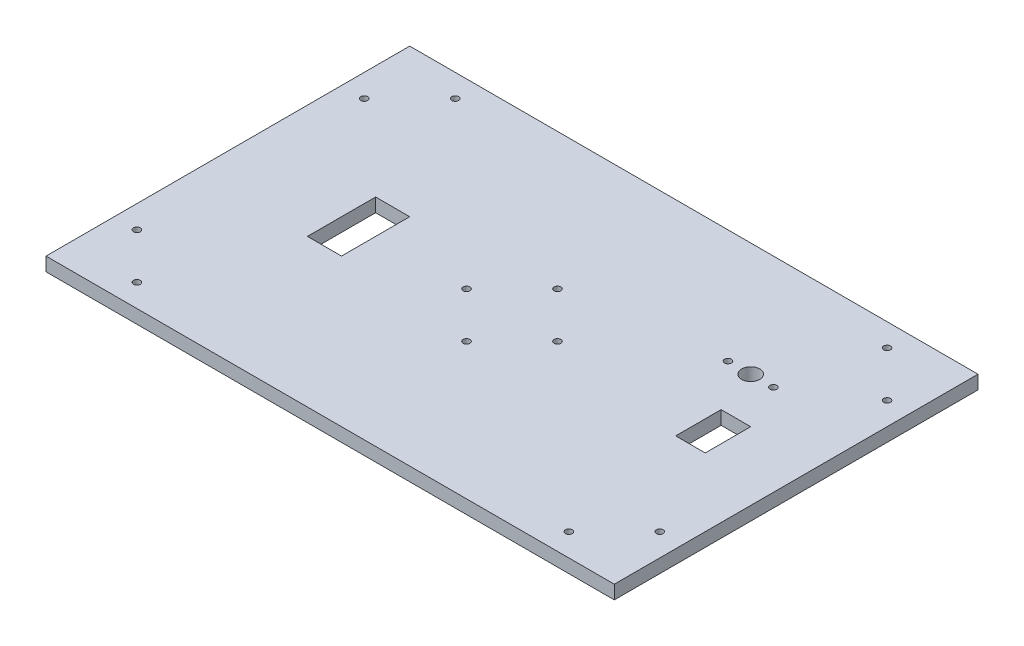
ISO-10303-21;
HEADER;
FILE_DESCRIPTION(('STEP AP214'),'2;1');
FILE_NAME('part.step','',(''),(''),'','','');
FILE_SCHEMA(('AUTOMOTIVE_DESIGN { 1 0 10303 214 1 1 1 1 }'));
ENDSEC;
DATA;
#1=APPLICATION_CONTEXT('core data for automotive mechanical design processes');
#2=APPLICATION_PROTOCOL_DEFINITION('international standard','automotive_design',2000,#1);
#3=PRODUCT_CONTEXT('',#1,'mechanical');
#4=PRODUCT('Part','Part','',(#3));
#5=PRODUCT_RELATED_PRODUCT_CATEGORY('part','',(#4));
#6=PRODUCT_DEFINITION_FORMATION('','',#4);
#7=PRODUCT_DEFINITION_CONTEXT('part definition',#1,'design');
#8=PRODUCT_DEFINITION('design','',#6,#7);
#9=PRODUCT_DEFINITION_SHAPE('','',#8);
#10=(LENGTH_UNIT() NAMED_UNIT(*) SI_UNIT(.MILLI.,.METRE.));
#11=(NAMED_UNIT(*) PLANE_ANGLE_UNIT() SI_UNIT($,.RADIAN.));
#12=(NAMED_UNIT(*) SI_UNIT($,.STERADIAN.) SOLID_ANGLE_UNIT());
#13=UNCERTAINTY_MEASURE_WITH_UNIT(LENGTH_MEASURE(1.E-05),#10,'distance_accuracy_value','');
#14=(GEOMETRIC_REPRESENTATION_CONTEXT(3) GLOBAL_UNCERTAINTY_ASSIGNED_CONTEXT((#13)) GLOBAL_UNIT_ASSIGNED_CONTEXT((#10,
#11,#12)) REPRESENTATION_CONTEXT('',''));
#15=CARTESIAN_POINT('',(0.,0.,0.));
#16=DIRECTION('',(0.,0.,1.));
#17=DIRECTION('',(1.,0.,0.));
#18=AXIS2_PLACEMENT_3D('',#15,#16,#17);
#19=CARTESIAN_POINT('',(-69.7029702970297,6.,78.9438943894389));
#20=DIRECTION('',(0.,0.,-1.));
#21=DIRECTION('',(-1.,0.,0.));
#22=AXIS2_PLACEMENT_3D('',#19,#20,#21);
#23=PLANE('',#22);
#24=DIRECTION('',(1.,0.,0.));
#25=VECTOR('',#24,1.);
#26=CARTESIAN_POINT('',(-69.7029702970297,0.,78.9438943894389));
#27=LINE('',#26,#25);
#28=CARTESIAN_POINT('',(-69.7029702970297,0.,78.9438943894389));
#29=VERTEX_POINT('',#28);
#30=CARTESIAN_POINT('',(180.29702970297,0.,78.9438943894389));
#31=VERTEX_POINT('',#30);
#32=EDGE_CURVE('E277',#29,#31,#27,.T.);
#33=ORIENTED_EDGE('',*,*,#32,.T.);
#34=DIRECTION('',(0.,-1.,0.));
#35=VECTOR('',#34,1.);
#36=CARTESIAN_POINT('',(180.29702970297,6.,78.9438943894389));
#37=LINE('',#36,#35);
#38=CARTESIAN_POINT('',(180.29702970297,6.,78.9438943894389));
#39=VERTEX_POINT('',#38);
#40=EDGE_CURVE('E11',#39,#31,#37,.T.);
#41=ORIENTED_EDGE('',*,*,#40,.F.);
#42=DIRECTION('',(1.,0.,0.));
#43=VECTOR('',#42,1.);
#44=CARTESIAN_POINT('',(-69.7029702970297,6.,78.9438943894389));
#45=LINE('',#44,#43);
#46=CARTESIAN_POINT('',(-69.7029702970297,6.,78.9438943894389));
#47=VERTEX_POINT('',#46);
#48=EDGE_CURVE('E280',#47,#39,#45,.T.);
#49=ORIENTED_EDGE('',*,*,#48,.F.);
#50=DIRECTION('',(0.,-1.,0.));
#51=VECTOR('',#50,1.);
#52=CARTESIAN_POINT('',(-69.7029702970297,6.,78.9438943894389));
#53=LINE('',#52,#51);
#54=EDGE_CURVE('E292',#47,#29,#53,.T.);
#55=ORIENTED_EDGE('',*,*,#54,.T.);
#56=EDGE_LOOP('',(#33,#41,#49,#55));
#57=FACE_BOUND('',#56,.T.);
#58=ADVANCED_FACE('F33',(#57),#23,.F.);
#59=CARTESIAN_POINT('',(180.29702970297,6.,78.9438943894389));
#60=DIRECTION('',(-1.,0.,0.));
#61=DIRECTION('',(0.,0.,1.));
#62=AXIS2_PLACEMENT_3D('',#59,#60,#61);
#63=PLANE('',#62);
#64=DIRECTION('',(0.,0.,-1.));
#65=VECTOR('',#64,1.);
#66=CARTESIAN_POINT('',(180.29702970297,0.,78.9438943894389));
#67=LINE('',#66,#65);
#68=CARTESIAN_POINT('',(180.29702970297,0.,-81.0561056105611));
#69=VERTEX_POINT('',#68);
#70=EDGE_CURVE('E295',#31,#69,#67,.T.);
#71=ORIENTED_EDGE('',*,*,#70,.T.);
#72=DIRECTION('',(0.,-1.,0.));
#73=VECTOR('',#72,1.);
#74=CARTESIAN_POINT('',(180.29702970297,6.,-81.0561056105611));
#75=LINE('',#74,#73);
#76=CARTESIAN_POINT('',(180.29702970297,6.,-81.0561056105611));
#77=VERTEX_POINT('',#76);
#78=EDGE_CURVE('E40',#77,#69,#75,.T.);
#79=ORIENTED_EDGE('',*,*,#78,.F.);
#80=DIRECTION('',(0.,0.,-1.));
#81=VECTOR('',#80,1.);
#82=CARTESIAN_POINT('',(180.29702970297,6.,78.9438943894389));
#83=LINE('',#82,#81);
#84=EDGE_CURVE('E283',#39,#77,#83,.T.);
#85=ORIENTED_EDGE('',*,*,#84,.F.);
#86=ORIENTED_EDGE('',*,*,#40,.T.);
#87=EDGE_LOOP('',(#71,#79,#85,#86));
#88=FACE_BOUND('',#87,.T.);
#89=ADVANCED_FACE('F311',(#88),#63,.F.);
#90=CARTESIAN_POINT('',(-69.7029702970297,6.,-81.0561056105611));
#91=DIRECTION('',(0.,0.,-1.));
#92=DIRECTION('',(-1.,0.,0.));
#93=AXIS2_PLACEMENT_3D('',#90,#91,#92);
#94=PLANE('',#93);
#95=DIRECTION('',(1.,0.,0.));
#96=VECTOR('',#95,1.);
#97=CARTESIAN_POINT('',(-69.7029702970297,0.,-81.0561056105611));
#98=LINE('',#97,#96);
#99=CARTESIAN_POINT('',(-69.7029702970297,0.,-81.0561056105611));
#100=VERTEX_POINT('',#99);
#101=EDGE_CURVE('E298',#100,#69,#98,.T.);
#102=ORIENTED_EDGE('',*,*,#101,.F.);
#103=DIRECTION('',(0.,-1.,0.));
#104=VECTOR('',#103,1.);
#105=CARTESIAN_POINT('',(-69.7029702970297,6.,-81.0561056105611));
#106=LINE('',#105,#104);
#107=CARTESIAN_POINT('',(-69.7029702970297,6.,-81.0561056105611));
#108=VERTEX_POINT('',#107);
#109=EDGE_CURVE('E304',#108,#100,#106,.T.);
#110=ORIENTED_EDGE('',*,*,#109,.F.);
#111=DIRECTION('',(1.,0.,0.));
#112=VECTOR('',#111,1.);
#113=CARTESIAN_POINT('',(-69.7029702970297,6.,-81.0561056105611));
#114=LINE('',#113,#112);
#115=EDGE_CURVE('E286',#108,#77,#114,.T.);
#116=ORIENTED_EDGE('',*,*,#115,.T.);
#117=ORIENTED_EDGE('',*,*,#78,.T.);
#118=EDGE_LOOP('',(#102,#110,#116,#117));
#119=FACE_BOUND('',#118,.T.);
#120=ADVANCED_FACE('F308',(#119),#94,.T.);
#121=CARTESIAN_POINT('',(-69.7029702970297,6.,78.9438943894389));
#122=DIRECTION('',(-1.,0.,0.));
#123=DIRECTION('',(0.,0.,1.));
#124=AXIS2_PLACEMENT_3D('',#121,#122,#123);
#125=PLANE('',#124);
#126=DIRECTION('',(0.,0.,-1.));
#127=VECTOR('',#126,1.);
#128=CARTESIAN_POINT('',(-69.7029702970297,0.,78.9438943894389));
#129=LINE('',#128,#127);
#130=EDGE_CURVE('E284',#29,#100,#129,.T.);
#131=ORIENTED_EDGE('',*,*,#130,.F.);
#132=ORIENTED_EDGE('',*,*,#54,.F.);
#133=DIRECTION('',(0.,0.,-1.));
#134=VECTOR('',#133,1.);
#135=CARTESIAN_POINT('',(-69.7029702970297,6.,78.9438943894389));
#136=LINE('',#135,#134);
#137=EDGE_CURVE('E289',#47,#108,#136,.T.);
#138=ORIENTED_EDGE('',*,*,#137,.T.);
#139=ORIENTED_EDGE('',*,*,#109,.T.);
#140=EDGE_LOOP('',(#131,#132,#138,#139));
#141=FACE_BOUND('',#140,.T.);
#142=ADVANCED_FACE('F317',(#141),#125,.T.);
#143=CARTESIAN_POINT('',(0.,6.,0.));
#144=DIRECTION('',(0.,1.,0.));
#145=DIRECTION('',(0.,0.,1.));
#146=AXIS2_PLACEMENT_3D('',#143,#144,#145);
#147=PLANE('',#146);
#148=DIRECTION('',(0.,0.,1.));
#149=VECTOR('',#148,1.);
#150=CARTESIAN_POINT('',(-19.7029702970298,6.,-16.056105610561));
#151=LINE('',#150,#149);
#152=CARTESIAN_POINT('',(-19.7029702970298,6.,-16.056105610561));
#153=VERTEX_POINT('',#152);
#154=CARTESIAN_POINT('',(-19.7029702970298,6.,13.943894389439));
#155=VERTEX_POINT('',#154);
#156=EDGE_CURVE('E47',#153,#155,#151,.T.);
#157=ORIENTED_EDGE('',*,*,#156,.F.);
#158=DIRECTION('',(-1.,0.,0.));
#159=VECTOR('',#158,1.);
#160=CARTESIAN_POINT('',(-19.7029702970298,6.,-16.056105610561));
#161=LINE('',#160,#159);
#162=CARTESIAN_POINT('',(-4.70297029702976,6.,-16.056105610561));
#163=VERTEX_POINT('',#162);
#164=EDGE_CURVE('E139',#163,#153,#161,.T.);
#165=ORIENTED_EDGE('',*,*,#164,.F.);
#166=DIRECTION('',(0.,0.,-1.));
#167=VECTOR('',#166,1.);
#168=CARTESIAN_POINT('',(-4.70297029702976,6.,-16.056105610561));
#169=LINE('',#168,#167);
#170=CARTESIAN_POINT('',(-4.70297029702975,6.,13.9438943894389));
#171=VERTEX_POINT('',#170);
#172=EDGE_CURVE('E142',#171,#163,#169,.T.);
#173=ORIENTED_EDGE('',*,*,#172,.F.);
#174=DIRECTION('',(1.,0.,0.));
#175=VECTOR('',#174,1.);
#176=CARTESIAN_POINT('',(-19.7029702970298,6.,13.943894389439));
#177=LINE('',#176,#175);
#178=EDGE_CURVE('E148',#155,#171,#177,.T.);
#179=ORIENTED_EDGE('',*,*,#178,.F.);
#180=EDGE_LOOP('',(#157,#165,#173,#179));
#181=FACE_BOUND('',#180,.T.);
#182=DIRECTION('',(0.,0.,1.));
#183=VECTOR('',#182,1.);
#184=CARTESIAN_POINT('',(137.29702970297,6.,-11.0561056105611));
#185=LINE('',#184,#183);
#186=CARTESIAN_POINT('',(137.29702970297,6.,-11.0561056105611));
#187=VERTEX_POINT('',#186);
#188=CARTESIAN_POINT('',(137.29702970297,6.,8.94389438943892));
#189=VERTEX_POINT('',#188);
#190=EDGE_CURVE('E172',#187,#189,#185,.T.);
#191=ORIENTED_EDGE('',*,*,#190,.F.);
#192=DIRECTION('',(-1.,0.,0.));
#193=VECTOR('',#192,1.);
#194=CARTESIAN_POINT('',(137.29702970297,6.,-11.0561056105611));
#195=LINE('',#194,#193);
#196=CARTESIAN_POINT('',(150.29702970297,6.,-11.0561056105611));
#197=VERTEX_POINT('',#196);
#198=EDGE_CURVE('E162',#197,#187,#195,.T.);
#199=ORIENTED_EDGE('',*,*,#198,.F.);
#200=DIRECTION('',(0.,0.,-1.));
#201=VECTOR('',#200,1.);
#202=CARTESIAN_POINT('',(150.29702970297,6.,-11.0561056105611));
#203=LINE('',#202,#201);
#204=CARTESIAN_POINT('',(150.29702970297,6.,8.94389438943892));
#205=VERTEX_POINT('',#204);
#206=EDGE_CURVE('E178',#205,#197,#203,.T.);
#207=ORIENTED_EDGE('',*,*,#206,.F.);
#208=DIRECTION('',(1.,0.,0.));
#209=VECTOR('',#208,1.);
#210=CARTESIAN_POINT('',(137.29702970297,6.,8.94389438943892));
#211=LINE('',#210,#209);
#212=EDGE_CURVE('E174',#189,#205,#211,.T.);
#213=ORIENTED_EDGE('',*,*,#212,.F.);
#214=EDGE_LOOP('',(#191,#199,#207,#213));
#215=FACE_BOUND('',#214,.T.);
#216=CARTESIAN_POINT('',(130.29702970297,6.,-31.0561056105611));
#217=DIRECTION('',(0.,1.,0.));
#218=DIRECTION('',(0.,0.,1.));
#219=AXIS2_PLACEMENT_3D('',#216,#217,#218);
#220=CIRCLE('',#219,3.99999999999999);
#221=CARTESIAN_POINT('',(130.29702970297,6.,-27.0561056105611));
#222=VERTEX_POINT('',#221);
#223=EDGE_CURVE('E154',#222,#222,#220,.T.);
#224=ORIENTED_EDGE('',*,*,#223,.F.);
#225=EDGE_LOOP('',(#224));
#226=FACE_BOUND('',#225,.T.);
#227=CARTESIAN_POINT('',(120.29702970297,6.,-31.0561056105611));
#228=DIRECTION('',(0.,1.,0.));
#229=DIRECTION('',(0.,0.,1.));
#230=AXIS2_PLACEMENT_3D('',#227,#228,#229);
#231=CIRCLE('',#230,1.5);
#232=CARTESIAN_POINT('',(120.29702970297,6.,-29.5561056105611));
#233=VERTEX_POINT('',#232);
#234=EDGE_CURVE('E195',#233,#233,#231,.T.);
#235=ORIENTED_EDGE('',*,*,#234,.F.);
#236=EDGE_LOOP('',(#235));
#237=FACE_BOUND('',#236,.T.);
#238=CARTESIAN_POINT('',(140.29702970297,6.,-31.0561056105611));
#239=DIRECTION('',(0.,1.,0.));
#240=DIRECTION('',(0.,0.,1.));
#241=AXIS2_PLACEMENT_3D('',#238,#239,#240);
#242=CIRCLE('',#241,1.5);
#243=CARTESIAN_POINT('',(140.29702970297,6.,-29.5561056105611));
#244=VERTEX_POINT('',#243);
#245=EDGE_CURVE('E200',#244,#244,#242,.T.);
#246=ORIENTED_EDGE('',*,*,#245,.F.);
#247=EDGE_LOOP('',(#246));
#248=FACE_BOUND('',#247,.T.);
#249=CARTESIAN_POINT('',(150.29702970297,6.,68.9438943894389));
#250=DIRECTION('',(0.,1.,0.));
#251=DIRECTION('',(0.,0.,1.));
#252=AXIS2_PLACEMENT_3D('',#249,#250,#251);
#253=CIRCLE('',#252,1.50000000000002);
#254=CARTESIAN_POINT('',(150.29702970297,6.,70.443894389439));
#255=VERTEX_POINT('',#254);
#256=EDGE_CURVE('E242',#255,#255,#253,.T.);
#257=ORIENTED_EDGE('',*,*,#256,.F.);
#258=EDGE_LOOP('',(#257));
#259=FACE_BOUND('',#258,.T.);
#260=CARTESIAN_POINT('',(-59.7029702970297,6.,48.9438943894389));
#261=DIRECTION('',(0.,1.,0.));
#262=DIRECTION('',(0.,0.,1.));
#263=AXIS2_PLACEMENT_3D('',#260,#261,#262);
#264=CIRCLE('',#263,1.5);
#265=CARTESIAN_POINT('',(-59.7029702970297,6.,50.4438943894389));
#266=VERTEX_POINT('',#265);
#267=EDGE_CURVE('E229',#266,#266,#264,.T.);
#268=ORIENTED_EDGE('',*,*,#267,.F.);
#269=EDGE_LOOP('',(#268));
#270=FACE_BOUND('',#269,.T.);
#271=CARTESIAN_POINT('',(-39.7029702970297,6.,68.9438943894389));
#272=DIRECTION('',(0.,1.,0.));
#273=DIRECTION('',(0.,0.,-1.));
#274=AXIS2_PLACEMENT_3D('',#271,#272,#273);
#275=CIRCLE('',#274,1.5);
#276=CARTESIAN_POINT('',(-39.7029702970297,6.,67.4438943894389));
#277=VERTEX_POINT('',#276);
#278=EDGE_CURVE('E230',#277,#277,#275,.T.);
#279=ORIENTED_EDGE('',*,*,#278,.F.);
#280=EDGE_LOOP('',(#279));
#281=FACE_BOUND('',#280,.T.);
#282=CARTESIAN_POINT('',(35.2970297029702,6.,-1.05610561056106));
#283=DIRECTION('',(0.,1.,0.));
#284=DIRECTION('',(0.,0.,1.));
#285=AXIS2_PLACEMENT_3D('',#282,#283,#284);
#286=CIRCLE('',#285,1.5);
#287=CARTESIAN_POINT('',(35.2970297029702,6.,0.443894389438942));
#288=VERTEX_POINT('',#287);
#289=EDGE_CURVE('E211',#288,#288,#286,.T.);
#290=ORIENTED_EDGE('',*,*,#289,.F.);
#291=EDGE_LOOP('',(#290));
#292=FACE_BOUND('',#291,.T.);
#293=CARTESIAN_POINT('',(170.29702970297,6.,48.9438943894389));
#294=DIRECTION('',(0.,1.,0.));
#295=DIRECTION('',(0.,0.,-1.));
#296=AXIS2_PLACEMENT_3D('',#293,#294,#295);
#297=CIRCLE('',#296,1.5);
#298=CARTESIAN_POINT('',(170.29702970297,6.,47.4438943894389));
#299=VERTEX_POINT('',#298);
#300=EDGE_CURVE('E241',#299,#299,#297,.T.);
#301=ORIENTED_EDGE('',*,*,#300,.F.);
#302=EDGE_LOOP('',(#301));
#303=FACE_BOUND('',#302,.T.);
#304=CARTESIAN_POINT('',(170.29702970297,6.,-51.0561056105611));
#305=DIRECTION('',(0.,1.,0.));
#306=DIRECTION('',(0.,0.,1.));
#307=AXIS2_PLACEMENT_3D('',#304,#305,#306);
#308=CIRCLE('',#307,1.5);
#309=CARTESIAN_POINT('',(170.29702970297,6.,-49.5561056105611));
#310=VERTEX_POINT('',#309);
#311=EDGE_CURVE('E266',#310,#310,#308,.T.);
#312=ORIENTED_EDGE('',*,*,#311,.F.);
#313=EDGE_LOOP('',(#312));
#314=FACE_BOUND('',#313,.T.);
#315=CARTESIAN_POINT('',(150.29702970297,6.,-71.056105610561));
#316=DIRECTION('',(0.,1.,0.));
#317=DIRECTION('',(0.,0.,-1.));
#318=AXIS2_PLACEMENT_3D('',#315,#316,#317);
#319=CIRCLE('',#318,1.50000000000002);
#320=CARTESIAN_POINT('',(150.29702970297,6.,-72.5561056105611));
#321=VERTEX_POINT('',#320);
#322=EDGE_CURVE('E260',#321,#321,#319,.T.);
#323=ORIENTED_EDGE('',*,*,#322,.F.);
#324=EDGE_LOOP('',(#323));
#325=FACE_BOUND('',#324,.T.);
#326=CARTESIAN_POINT('',(-59.7029702970297,6.,-51.0561056105611));
#327=DIRECTION('',(0.,1.,0.));
#328=DIRECTION('',(0.,0.,-1.));
#329=AXIS2_PLACEMENT_3D('',#326,#327,#328);
#330=CIRCLE('',#329,1.5);
#331=CARTESIAN_POINT('',(-59.7029702970297,6.,-52.5561056105611));
#332=VERTEX_POINT('',#331);
#333=EDGE_CURVE('E254',#332,#332,#330,.T.);
#334=ORIENTED_EDGE('',*,*,#333,.F.);
#335=EDGE_LOOP('',(#334));
#336=FACE_BOUND('',#335,.T.);
#337=CARTESIAN_POINT('',(55.2970297029702,6.,-21.0561056105611));
#338=DIRECTION('',(0.,1.,0.));
#339=DIRECTION('',(0.,0.,-1.));
#340=AXIS2_PLACEMENT_3D('',#337,#338,#339);
#341=CIRCLE('',#340,1.5);
#342=CARTESIAN_POINT('',(55.2970297029702,6.,-22.5561056105611));
#343=VERTEX_POINT('',#342);
#344=EDGE_CURVE('E212',#343,#343,#341,.T.);
#345=ORIENTED_EDGE('',*,*,#344,.F.);
#346=EDGE_LOOP('',(#345));
#347=FACE_BOUND('',#346,.T.);
#348=CARTESIAN_POINT('',(55.2970297029702,6.,18.9438943894389));
#349=DIRECTION('',(0.,1.,0.));
#350=DIRECTION('',(0.,0.,-1.));
#351=AXIS2_PLACEMENT_3D('',#348,#349,#350);
#352=CIRCLE('',#351,1.5);
#353=CARTESIAN_POINT('',(55.2970297029702,6.,17.4438943894389));
#354=VERTEX_POINT('',#353);
#355=EDGE_CURVE('E218',#354,#354,#352,.T.);
#356=ORIENTED_EDGE('',*,*,#355,.F.);
#357=EDGE_LOOP('',(#356));
#358=FACE_BOUND('',#357,.T.);
#359=CARTESIAN_POINT('',(75.2970297029702,6.,-1.05610561056105));
#360=DIRECTION('',(0.,1.,0.));
#361=DIRECTION('',(0.,0.,1.));
#362=AXIS2_PLACEMENT_3D('',#359,#360,#361);
#363=CIRCLE('',#362,1.50000000000003);
#364=CARTESIAN_POINT('',(75.2970297029702,6.,0.443894389438978));
#365=VERTEX_POINT('',#364);
#366=EDGE_CURVE('E185',#365,#365,#363,.T.);
#367=ORIENTED_EDGE('',*,*,#366,.F.);
#368=EDGE_LOOP('',(#367));
#369=FACE_BOUND('',#368,.T.);
#370=CARTESIAN_POINT('',(-39.7029702970297,6.,-71.056105610561));
#371=DIRECTION('',(0.,1.,0.));
#372=DIRECTION('',(0.,0.,1.));
#373=AXIS2_PLACEMENT_3D('',#370,#371,#372);
#374=CIRCLE('',#373,1.5);
#375=CARTESIAN_POINT('',(-39.7029702970297,6.,-69.556105610561));
#376=VERTEX_POINT('',#375);
#377=EDGE_CURVE('E253',#376,#376,#374,.T.);
#378=ORIENTED_EDGE('',*,*,#377,.F.);
#379=EDGE_LOOP('',(#378));
#380=FACE_BOUND('',#379,.T.);
#381=ORIENTED_EDGE('',*,*,#48,.T.);
#382=ORIENTED_EDGE('',*,*,#84,.T.);
#383=ORIENTED_EDGE('',*,*,#115,.F.);
#384=ORIENTED_EDGE('',*,*,#137,.F.);
#385=EDGE_LOOP('',(#381,#382,#383,#384));
#386=FACE_BOUND('',#385,.T.);
#387=ADVANCED_FACE('F321',(#181,#215,#226,#237,#248,#259,#270,#281,#292,#303,#314,#325,#336,
#347,#358,#369,#380,#386),#147,.T.);
#388=CARTESIAN_POINT('',(0.,0.,0.));
#389=DIRECTION('',(0.,1.,0.));
#390=DIRECTION('',(0.,0.,1.));
#391=AXIS2_PLACEMENT_3D('',#388,#389,#390);
#392=PLANE('',#391);
#393=DIRECTION('',(-1.,0.,0.));
#394=VECTOR('',#393,1.);
#395=CARTESIAN_POINT('',(-19.7029702970298,0.,-16.056105610561));
#396=LINE('',#395,#394);
#397=CARTESIAN_POINT('',(-4.70297029702976,0.,-16.056105610561));
#398=VERTEX_POINT('',#397);
#399=CARTESIAN_POINT('',(-19.7029702970298,0.,-16.056105610561));
#400=VERTEX_POINT('',#399);
#401=EDGE_CURVE('E129',#398,#400,#396,.T.);
#402=ORIENTED_EDGE('',*,*,#401,.T.);
#403=DIRECTION('',(0.,0.,1.));
#404=VECTOR('',#403,1.);
#405=CARTESIAN_POINT('',(-19.7029702970298,0.,-16.056105610561));
#406=LINE('',#405,#404);
#407=CARTESIAN_POINT('',(-19.7029702970298,0.,13.943894389439));
#408=VERTEX_POINT('',#407);
#409=EDGE_CURVE('E123',#400,#408,#406,.T.);
#410=ORIENTED_EDGE('',*,*,#409,.T.);
#411=DIRECTION('',(1.,0.,0.));
#412=VECTOR('',#411,1.);
#413=CARTESIAN_POINT('',(-19.7029702970298,0.,13.943894389439));
#414=LINE('',#413,#412);
#415=CARTESIAN_POINT('',(-4.70297029702975,0.,13.9438943894389));
#416=VERTEX_POINT('',#415);
#417=EDGE_CURVE('E132',#408,#416,#414,.T.);
#418=ORIENTED_EDGE('',*,*,#417,.T.);
#419=DIRECTION('',(0.,0.,-1.));
#420=VECTOR('',#419,1.);
#421=CARTESIAN_POINT('',(-4.70297029702976,0.,-16.056105610561));
#422=LINE('',#421,#420);
#423=EDGE_CURVE('E55',#416,#398,#422,.T.);
#424=ORIENTED_EDGE('',*,*,#423,.T.);
#425=EDGE_LOOP('',(#402,#410,#418,#424));
#426=FACE_BOUND('',#425,.T.);
#427=DIRECTION('',(-1.,0.,0.));
#428=VECTOR('',#427,1.);
#429=CARTESIAN_POINT('',(137.29702970297,0.,-11.0561056105611));
#430=LINE('',#429,#428);
#431=CARTESIAN_POINT('',(150.29702970297,0.,-11.0561056105611));
#432=VERTEX_POINT('',#431);
#433=CARTESIAN_POINT('',(137.29702970297,0.,-11.0561056105611));
#434=VERTEX_POINT('',#433);
#435=EDGE_CURVE('E168',#432,#434,#430,.T.);
#436=ORIENTED_EDGE('',*,*,#435,.T.);
#437=DIRECTION('',(0.,0.,1.));
#438=VECTOR('',#437,1.);
#439=CARTESIAN_POINT('',(137.29702970297,0.,-11.0561056105611));
#440=LINE('',#439,#438);
#441=CARTESIAN_POINT('',(137.29702970297,0.,8.94389438943892));
#442=VERTEX_POINT('',#441);
#443=EDGE_CURVE('E158',#434,#442,#440,.T.);
#444=ORIENTED_EDGE('',*,*,#443,.T.);
#445=DIRECTION('',(1.,0.,0.));
#446=VECTOR('',#445,1.);
#447=CARTESIAN_POINT('',(137.29702970297,0.,8.94389438943892));
#448=LINE('',#447,#446);
#449=CARTESIAN_POINT('',(150.29702970297,0.,8.94389438943892));
#450=VERTEX_POINT('',#449);
#451=EDGE_CURVE('E161',#442,#450,#448,.T.);
#452=ORIENTED_EDGE('',*,*,#451,.T.);
#453=DIRECTION('',(0.,0.,-1.));
#454=VECTOR('',#453,1.);
#455=CARTESIAN_POINT('',(150.29702970297,0.,-11.0561056105611));
#456=LINE('',#455,#454);
#457=EDGE_CURVE('E165',#450,#432,#456,.T.);
#458=ORIENTED_EDGE('',*,*,#457,.T.);
#459=EDGE_LOOP('',(#436,#444,#452,#458));
#460=FACE_BOUND('',#459,.T.);
#461=CARTESIAN_POINT('',(130.29702970297,0.,-31.0561056105611));
#462=DIRECTION('',(0.,1.,0.));
#463=DIRECTION('',(0.,0.,1.));
#464=AXIS2_PLACEMENT_3D('',#461,#462,#463);
#465=CIRCLE('',#464,3.99999999999999);
#466=CARTESIAN_POINT('',(130.29702970297,0.,-27.0561056105611));
#467=VERTEX_POINT('',#466);
#468=EDGE_CURVE('E192',#467,#467,#465,.T.);
#469=ORIENTED_EDGE('',*,*,#468,.T.);
#470=EDGE_LOOP('',(#469));
#471=FACE_BOUND('',#470,.T.);
#472=CARTESIAN_POINT('',(120.29702970297,0.,-31.0561056105611));
#473=DIRECTION('',(0.,1.,0.));
#474=DIRECTION('',(0.,0.,1.));
#475=AXIS2_PLACEMENT_3D('',#472,#473,#474);
#476=CIRCLE('',#475,1.5);
#477=CARTESIAN_POINT('',(120.29702970297,0.,-29.5561056105611));
#478=VERTEX_POINT('',#477);
#479=EDGE_CURVE('E203',#478,#478,#476,.T.);
#480=ORIENTED_EDGE('',*,*,#479,.T.);
#481=EDGE_LOOP('',(#480));
#482=FACE_BOUND('',#481,.T.);
#483=CARTESIAN_POINT('',(140.29702970297,0.,-31.0561056105611));
#484=DIRECTION('',(0.,1.,0.));
#485=DIRECTION('',(0.,0.,1.));
#486=AXIS2_PLACEMENT_3D('',#483,#484,#485);
#487=CIRCLE('',#486,1.5);
#488=CARTESIAN_POINT('',(140.29702970297,0.,-29.5561056105611));
#489=VERTEX_POINT('',#488);
#490=EDGE_CURVE('E175',#489,#489,#487,.T.);
#491=ORIENTED_EDGE('',*,*,#490,.T.);
#492=EDGE_LOOP('',(#491));
#493=FACE_BOUND('',#492,.T.);
#494=CARTESIAN_POINT('',(150.29702970297,0.,68.9438943894389));
#495=DIRECTION('',(0.,1.,0.));
#496=DIRECTION('',(0.,0.,1.));
#497=AXIS2_PLACEMENT_3D('',#494,#495,#496);
#498=CIRCLE('',#497,1.50000000000002);
#499=CARTESIAN_POINT('',(150.29702970297,0.,70.443894389439));
#500=VERTEX_POINT('',#499);
#501=EDGE_CURVE('E238',#500,#500,#498,.T.);
#502=ORIENTED_EDGE('',*,*,#501,.T.);
#503=EDGE_LOOP('',(#502));
#504=FACE_BOUND('',#503,.T.);
#505=CARTESIAN_POINT('',(-59.7029702970297,0.,48.9438943894389));
#506=DIRECTION('',(0.,1.,0.));
#507=DIRECTION('',(0.,0.,1.));
#508=AXIS2_PLACEMENT_3D('',#505,#506,#507);
#509=CIRCLE('',#508,1.5);
#510=CARTESIAN_POINT('',(-59.7029702970297,0.,50.4438943894389));
#511=VERTEX_POINT('',#510);
#512=EDGE_CURVE('E245',#511,#511,#509,.T.);
#513=ORIENTED_EDGE('',*,*,#512,.T.);
#514=EDGE_LOOP('',(#513));
#515=FACE_BOUND('',#514,.T.);
#516=CARTESIAN_POINT('',(-39.7029702970297,0.,68.9438943894389));
#517=DIRECTION('',(0.,1.,0.));
#518=DIRECTION('',(0.,0.,-1.));
#519=AXIS2_PLACEMENT_3D('',#516,#517,#518);
#520=CIRCLE('',#519,1.5);
#521=CARTESIAN_POINT('',(-39.7029702970297,0.,67.4438943894389));
#522=VERTEX_POINT('',#521);
#523=EDGE_CURVE('E226',#522,#522,#520,.T.);
#524=ORIENTED_EDGE('',*,*,#523,.T.);
#525=EDGE_LOOP('',(#524));
#526=FACE_BOUND('',#525,.T.);
#527=CARTESIAN_POINT('',(35.2970297029702,0.,-1.05610561056106));
#528=DIRECTION('',(0.,1.,0.));
#529=DIRECTION('',(0.,0.,1.));
#530=AXIS2_PLACEMENT_3D('',#527,#528,#529);
#531=CIRCLE('',#530,1.5);
#532=CARTESIAN_POINT('',(35.2970297029702,0.,0.443894389438942));
#533=VERTEX_POINT('',#532);
#534=EDGE_CURVE('E233',#533,#533,#531,.T.);
#535=ORIENTED_EDGE('',*,*,#534,.T.);
#536=EDGE_LOOP('',(#535));
#537=FACE_BOUND('',#536,.T.);
#538=CARTESIAN_POINT('',(170.29702970297,0.,48.9438943894389));
#539=DIRECTION('',(0.,1.,0.));
#540=DIRECTION('',(0.,0.,-1.));
#541=AXIS2_PLACEMENT_3D('',#538,#539,#540);
#542=CIRCLE('',#541,1.5);
#543=CARTESIAN_POINT('',(170.29702970297,0.,47.4438943894389));
#544=VERTEX_POINT('',#543);
#545=EDGE_CURVE('E269',#544,#544,#542,.T.);
#546=ORIENTED_EDGE('',*,*,#545,.T.);
#547=EDGE_LOOP('',(#546));
#548=FACE_BOUND('',#547,.T.);
#549=CARTESIAN_POINT('',(170.29702970297,0.,-51.0561056105611));
#550=DIRECTION('',(0.,1.,0.));
#551=DIRECTION('',(0.,0.,1.));
#552=AXIS2_PLACEMENT_3D('',#549,#550,#551);
#553=CIRCLE('',#552,1.5);
#554=CARTESIAN_POINT('',(170.29702970297,0.,-49.5561056105611));
#555=VERTEX_POINT('',#554);
#556=EDGE_CURVE('E263',#555,#555,#553,.T.);
#557=ORIENTED_EDGE('',*,*,#556,.T.);
#558=EDGE_LOOP('',(#557));
#559=FACE_BOUND('',#558,.T.);
#560=CARTESIAN_POINT('',(150.29702970297,0.,-71.056105610561));
#561=DIRECTION('',(0.,1.,0.));
#562=DIRECTION('',(0.,0.,-1.));
#563=AXIS2_PLACEMENT_3D('',#560,#561,#562);
#564=CIRCLE('',#563,1.50000000000002);
#565=CARTESIAN_POINT('',(150.29702970297,0.,-72.5561056105611));
#566=VERTEX_POINT('',#565);
#567=EDGE_CURVE('E257',#566,#566,#564,.T.);
#568=ORIENTED_EDGE('',*,*,#567,.T.);
#569=EDGE_LOOP('',(#568));
#570=FACE_BOUND('',#569,.T.);
#571=CARTESIAN_POINT('',(-59.7029702970297,0.,-51.0561056105611));
#572=DIRECTION('',(0.,1.,0.));
#573=DIRECTION('',(0.,0.,-1.));
#574=AXIS2_PLACEMENT_3D('',#571,#572,#573);
#575=CIRCLE('',#574,1.5);
#576=CARTESIAN_POINT('',(-59.7029702970297,0.,-52.5561056105611));
#577=VERTEX_POINT('',#576);
#578=EDGE_CURVE('E250',#577,#577,#575,.T.);
#579=ORIENTED_EDGE('',*,*,#578,.T.);
#580=EDGE_LOOP('',(#579));
#581=FACE_BOUND('',#580,.T.);
#582=CARTESIAN_POINT('',(55.2970297029702,0.,-21.0561056105611));
#583=DIRECTION('',(0.,1.,0.));
#584=DIRECTION('',(0.,0.,-1.));
#585=AXIS2_PLACEMENT_3D('',#582,#583,#584);
#586=CIRCLE('',#585,1.5);
#587=CARTESIAN_POINT('',(55.2970297029702,0.,-22.5561056105611));
#588=VERTEX_POINT('',#587);
#589=EDGE_CURVE('E208',#588,#588,#586,.T.);
#590=ORIENTED_EDGE('',*,*,#589,.T.);
#591=EDGE_LOOP('',(#590));
#592=FACE_BOUND('',#591,.T.);
#593=CARTESIAN_POINT('',(55.2970297029702,0.,18.9438943894389));
#594=DIRECTION('',(0.,1.,0.));
#595=DIRECTION('',(0.,0.,-1.));
#596=AXIS2_PLACEMENT_3D('',#593,#594,#595);
#597=CIRCLE('',#596,1.5);
#598=CARTESIAN_POINT('',(55.2970297029702,0.,17.4438943894389));
#599=VERTEX_POINT('',#598);
#600=EDGE_CURVE('E215',#599,#599,#597,.T.);
#601=ORIENTED_EDGE('',*,*,#600,.T.);
#602=EDGE_LOOP('',(#601));
#603=FACE_BOUND('',#602,.T.);
#604=CARTESIAN_POINT('',(75.2970297029702,0.,-1.05610561056105));
#605=DIRECTION('',(0.,1.,0.));
#606=DIRECTION('',(0.,0.,1.));
#607=AXIS2_PLACEMENT_3D('',#604,#605,#606);
#608=CIRCLE('',#607,1.50000000000003);
#609=CARTESIAN_POINT('',(75.2970297029702,0.,0.443894389438978));
#610=VERTEX_POINT('',#609);
#611=EDGE_CURVE('E221',#610,#610,#608,.T.);
#612=ORIENTED_EDGE('',*,*,#611,.T.);
#613=EDGE_LOOP('',(#612));
#614=FACE_BOUND('',#613,.T.);
#615=CARTESIAN_POINT('',(-39.7029702970297,0.,-71.056105610561));
#616=DIRECTION('',(0.,1.,0.));
#617=DIRECTION('',(0.,0.,1.));
#618=AXIS2_PLACEMENT_3D('',#615,#616,#617);
#619=CIRCLE('',#618,1.5);
#620=CARTESIAN_POINT('',(-39.7029702970297,0.,-69.556105610561));
#621=VERTEX_POINT('',#620);
#622=EDGE_CURVE('E274',#621,#621,#619,.T.);
#623=ORIENTED_EDGE('',*,*,#622,.T.);
#624=EDGE_LOOP('',(#623));
#625=FACE_BOUND('',#624,.T.);
#626=ORIENTED_EDGE('',*,*,#32,.F.);
#627=ORIENTED_EDGE('',*,*,#130,.T.);
#628=ORIENTED_EDGE('',*,*,#101,.T.);
#629=ORIENTED_EDGE('',*,*,#70,.F.);
#630=EDGE_LOOP('',(#626,#627,#628,#629));
#631=FACE_BOUND('',#630,.T.);
#632=ADVANCED_FACE('F136',(#426,#460,#471,#482,#493,#504,#515,#526,#537,#548,#559,#570,#581,
#592,#603,#614,#625,#631),#392,.F.);
#633=CARTESIAN_POINT('',(-39.7029702970297,0.,-71.056105610561));
#634=DIRECTION('',(0.,1.,0.));
#635=DIRECTION('',(0.,0.,1.));
#636=AXIS2_PLACEMENT_3D('',#633,#634,#635);
#637=CYLINDRICAL_SURFACE('',#636,1.5);
#638=ORIENTED_EDGE('',*,*,#622,.F.);
#639=EDGE_LOOP('',(#638));
#640=FACE_BOUND('',#639,.T.);
#641=ORIENTED_EDGE('',*,*,#377,.T.);
#642=EDGE_LOOP('',(#641));
#643=FACE_BOUND('',#642,.T.);
#644=ADVANCED_FACE('F336',(#640,#643),#637,.F.);
#645=CARTESIAN_POINT('',(75.2970297029702,0.,-1.05610561056105));
#646=DIRECTION('',(0.,1.,0.));
#647=DIRECTION('',(0.,0.,1.));
#648=AXIS2_PLACEMENT_3D('',#645,#646,#647);
#649=CYLINDRICAL_SURFACE('',#648,1.50000000000003);
#650=ORIENTED_EDGE('',*,*,#611,.F.);
#651=EDGE_LOOP('',(#650));
#652=FACE_BOUND('',#651,.T.);
#653=ORIENTED_EDGE('',*,*,#366,.T.);
#654=EDGE_LOOP('',(#653));
#655=FACE_BOUND('',#654,.T.);
#656=ADVANCED_FACE('F342',(#652,#655),#649,.F.);
#657=CARTESIAN_POINT('',(55.2970297029702,0.,18.9438943894389));
#658=DIRECTION('',(0.,1.,0.));
#659=DIRECTION('',(0.,0.,1.));
#660=AXIS2_PLACEMENT_3D('',#657,#658,#659);
#661=CYLINDRICAL_SURFACE('',#660,1.5);
#662=ORIENTED_EDGE('',*,*,#600,.F.);
#663=EDGE_LOOP('',(#662));
#664=FACE_BOUND('',#663,.T.);
#665=ORIENTED_EDGE('',*,*,#355,.T.);
#666=EDGE_LOOP('',(#665));
#667=FACE_BOUND('',#666,.T.);
#668=ADVANCED_FACE('F380',(#664,#667),#661,.F.);
#669=CARTESIAN_POINT('',(55.2970297029702,0.,-21.0561056105611));
#670=DIRECTION('',(0.,1.,0.));
#671=DIRECTION('',(0.,0.,1.));
#672=AXIS2_PLACEMENT_3D('',#669,#670,#671);
#673=CYLINDRICAL_SURFACE('',#672,1.5);
#674=ORIENTED_EDGE('',*,*,#589,.F.);
#675=EDGE_LOOP('',(#674));
#676=FACE_BOUND('',#675,.T.);
#677=ORIENTED_EDGE('',*,*,#344,.T.);
#678=EDGE_LOOP('',(#677));
#679=FACE_BOUND('',#678,.T.);
#680=ADVANCED_FACE('F360',(#676,#679),#673,.F.);
#681=CARTESIAN_POINT('',(-59.7029702970297,0.,-51.0561056105611));
#682=DIRECTION('',(0.,1.,0.));
#683=DIRECTION('',(0.,0.,1.));
#684=AXIS2_PLACEMENT_3D('',#681,#682,#683);
#685=CYLINDRICAL_SURFACE('',#684,1.5);
#686=ORIENTED_EDGE('',*,*,#578,.F.);
#687=EDGE_LOOP('',(#686));
#688=FACE_BOUND('',#687,.T.);
#689=ORIENTED_EDGE('',*,*,#333,.T.);
#690=EDGE_LOOP('',(#689));
#691=FACE_BOUND('',#690,.T.);
#692=ADVANCED_FACE('F356',(#688,#691),#685,.F.);
#693=CARTESIAN_POINT('',(150.29702970297,0.,-71.056105610561));
#694=DIRECTION('',(0.,1.,0.));
#695=DIRECTION('',(0.,0.,1.));
#696=AXIS2_PLACEMENT_3D('',#693,#694,#695);
#697=CYLINDRICAL_SURFACE('',#696,1.50000000000002);
#698=ORIENTED_EDGE('',*,*,#567,.F.);
#699=EDGE_LOOP('',(#698));
#700=FACE_BOUND('',#699,.T.);
#701=ORIENTED_EDGE('',*,*,#322,.T.);
#702=EDGE_LOOP('',(#701));
#703=FACE_BOUND('',#702,.T.);
#704=ADVANCED_FACE('F352',(#700,#703),#697,.F.);
#705=CARTESIAN_POINT('',(170.29702970297,0.,-51.0561056105611));
#706=DIRECTION('',(0.,1.,0.));
#707=DIRECTION('',(0.,0.,1.));
#708=AXIS2_PLACEMENT_3D('',#705,#706,#707);
#709=CYLINDRICAL_SURFACE('',#708,1.5);
#710=ORIENTED_EDGE('',*,*,#556,.F.);
#711=EDGE_LOOP('',(#710));
#712=FACE_BOUND('',#711,.T.);
#713=ORIENTED_EDGE('',*,*,#311,.T.);
#714=EDGE_LOOP('',(#713));
#715=FACE_BOUND('',#714,.T.);
#716=ADVANCED_FACE('F348',(#712,#715),#709,.F.);
#717=CARTESIAN_POINT('',(170.29702970297,0.,48.9438943894389));
#718=DIRECTION('',(0.,1.,0.));
#719=DIRECTION('',(0.,0.,1.));
#720=AXIS2_PLACEMENT_3D('',#717,#718,#719);
#721=CYLINDRICAL_SURFACE('',#720,1.5);
#722=ORIENTED_EDGE('',*,*,#545,.F.);
#723=EDGE_LOOP('',(#722));
#724=FACE_BOUND('',#723,.T.);
#725=ORIENTED_EDGE('',*,*,#300,.T.);
#726=EDGE_LOOP('',(#725));
#727=FACE_BOUND('',#726,.T.);
#728=ADVANCED_FACE('F344',(#724,#727),#721,.F.);
#729=CARTESIAN_POINT('',(35.2970297029702,0.,-1.05610561056106));
#730=DIRECTION('',(0.,1.,0.));
#731=DIRECTION('',(0.,0.,1.));
#732=AXIS2_PLACEMENT_3D('',#729,#730,#731);
#733=CYLINDRICAL_SURFACE('',#732,1.5);
#734=ORIENTED_EDGE('',*,*,#534,.F.);
#735=EDGE_LOOP('',(#734));
#736=FACE_BOUND('',#735,.T.);
#737=ORIENTED_EDGE('',*,*,#289,.T.);
#738=EDGE_LOOP('',(#737));
#739=FACE_BOUND('',#738,.T.);
#740=ADVANCED_FACE('F347',(#736,#739),#733,.F.);
#741=CARTESIAN_POINT('',(-39.7029702970297,0.,68.9438943894389));
#742=DIRECTION('',(0.,1.,0.));
#743=DIRECTION('',(0.,0.,1.));
#744=AXIS2_PLACEMENT_3D('',#741,#742,#743);
#745=CYLINDRICAL_SURFACE('',#744,1.5);
#746=ORIENTED_EDGE('',*,*,#523,.F.);
#747=EDGE_LOOP('',(#746));
#748=FACE_BOUND('',#747,.T.);
#749=ORIENTED_EDGE('',*,*,#278,.T.);
#750=EDGE_LOOP('',(#749));
#751=FACE_BOUND('',#750,.T.);
#752=ADVANCED_FACE('F366',(#748,#751),#745,.F.);
#753=CARTESIAN_POINT('',(-59.7029702970297,0.,48.9438943894389));
#754=DIRECTION('',(0.,1.,0.));
#755=DIRECTION('',(0.,0.,1.));
#756=AXIS2_PLACEMENT_3D('',#753,#754,#755);
#757=CYLINDRICAL_SURFACE('',#756,1.5);
#758=ORIENTED_EDGE('',*,*,#512,.F.);
#759=EDGE_LOOP('',(#758));
#760=FACE_BOUND('',#759,.T.);
#761=ORIENTED_EDGE('',*,*,#267,.T.);
#762=EDGE_LOOP('',(#761));
#763=FACE_BOUND('',#762,.T.);
#764=ADVANCED_FACE('F362',(#760,#763),#757,.F.);
#765=CARTESIAN_POINT('',(150.29702970297,0.,68.9438943894389));
#766=DIRECTION('',(0.,1.,0.));
#767=DIRECTION('',(0.,0.,1.));
#768=AXIS2_PLACEMENT_3D('',#765,#766,#767);
#769=CYLINDRICAL_SURFACE('',#768,1.50000000000002);
#770=ORIENTED_EDGE('',*,*,#501,.F.);
#771=EDGE_LOOP('',(#770));
#772=FACE_BOUND('',#771,.T.);
#773=ORIENTED_EDGE('',*,*,#256,.T.);
#774=EDGE_LOOP('',(#773));
#775=FACE_BOUND('',#774,.T.);
#776=ADVANCED_FACE('F365',(#772,#775),#769,.F.);
#777=CARTESIAN_POINT('',(140.29702970297,0.,-31.0561056105611));
#778=DIRECTION('',(0.,1.,0.));
#779=DIRECTION('',(0.,0.,1.));
#780=AXIS2_PLACEMENT_3D('',#777,#778,#779);
#781=CYLINDRICAL_SURFACE('',#780,1.5);
#782=ORIENTED_EDGE('',*,*,#490,.F.);
#783=EDGE_LOOP('',(#782));
#784=FACE_BOUND('',#783,.T.);
#785=ORIENTED_EDGE('',*,*,#245,.T.);
#786=EDGE_LOOP('',(#785));
#787=FACE_BOUND('',#786,.T.);
#788=ADVANCED_FACE('F370',(#784,#787),#781,.F.);
#789=CARTESIAN_POINT('',(120.29702970297,0.,-31.0561056105611));
#790=DIRECTION('',(0.,1.,0.));
#791=DIRECTION('',(0.,0.,1.));
#792=AXIS2_PLACEMENT_3D('',#789,#790,#791);
#793=CYLINDRICAL_SURFACE('',#792,1.5);
#794=ORIENTED_EDGE('',*,*,#479,.F.);
#795=EDGE_LOOP('',(#794));
#796=FACE_BOUND('',#795,.T.);
#797=ORIENTED_EDGE('',*,*,#234,.T.);
#798=EDGE_LOOP('',(#797));
#799=FACE_BOUND('',#798,.T.);
#800=ADVANCED_FACE('F388',(#796,#799),#793,.F.);
#801=CARTESIAN_POINT('',(130.29702970297,0.,-31.0561056105611));
#802=DIRECTION('',(0.,1.,0.));
#803=DIRECTION('',(0.,0.,1.));
#804=AXIS2_PLACEMENT_3D('',#801,#802,#803);
#805=CYLINDRICAL_SURFACE('',#804,3.99999999999999);
#806=ORIENTED_EDGE('',*,*,#468,.F.);
#807=EDGE_LOOP('',(#806));
#808=FACE_BOUND('',#807,.T.);
#809=ORIENTED_EDGE('',*,*,#223,.T.);
#810=EDGE_LOOP('',(#809));
#811=FACE_BOUND('',#810,.T.);
#812=ADVANCED_FACE('F391',(#808,#811),#805,.F.);
#813=CARTESIAN_POINT('',(137.29702970297,0.,-11.0561056105611));
#814=DIRECTION('',(-1.,0.,0.));
#815=DIRECTION('',(0.,0.,1.));
#816=AXIS2_PLACEMENT_3D('',#813,#814,#815);
#817=PLANE('',#816);
#818=ORIENTED_EDGE('',*,*,#190,.T.);
#819=DIRECTION('',(0.,1.,0.));
#820=VECTOR('',#819,1.);
#821=CARTESIAN_POINT('',(137.29702970297,0.,8.94389438943892));
#822=LINE('',#821,#820);
#823=EDGE_CURVE('E171',#442,#189,#822,.T.);
#824=ORIENTED_EDGE('',*,*,#823,.F.);
#825=ORIENTED_EDGE('',*,*,#443,.F.);
#826=DIRECTION('',(0.,1.,0.));
#827=VECTOR('',#826,1.);
#828=CARTESIAN_POINT('',(137.29702970297,0.,-11.0561056105611));
#829=LINE('',#828,#827);
#830=EDGE_CURVE('E183',#434,#187,#829,.T.);
#831=ORIENTED_EDGE('',*,*,#830,.T.);
#832=EDGE_LOOP('',(#818,#824,#825,#831));
#833=FACE_BOUND('',#832,.T.);
#834=ADVANCED_FACE('F398',(#833),#817,.F.);
#835=CARTESIAN_POINT('',(137.29702970297,0.,-11.0561056105611));
#836=DIRECTION('',(0.,0.,-1.));
#837=DIRECTION('',(-1.,0.,0.));
#838=AXIS2_PLACEMENT_3D('',#835,#836,#837);
#839=PLANE('',#838);
#840=ORIENTED_EDGE('',*,*,#198,.T.);
#841=ORIENTED_EDGE('',*,*,#830,.F.);
#842=ORIENTED_EDGE('',*,*,#435,.F.);
#843=DIRECTION('',(0.,1.,0.));
#844=VECTOR('',#843,1.);
#845=CARTESIAN_POINT('',(150.29702970297,0.,-11.0561056105611));
#846=LINE('',#845,#844);
#847=EDGE_CURVE('E186',#432,#197,#846,.T.);
#848=ORIENTED_EDGE('',*,*,#847,.T.);
#849=EDGE_LOOP('',(#840,#841,#842,#848));
#850=FACE_BOUND('',#849,.T.);
#851=ADVANCED_FACE('F402',(#850),#839,.F.);
#852=CARTESIAN_POINT('',(150.29702970297,0.,-11.0561056105611));
#853=DIRECTION('',(1.,0.,0.));
#854=DIRECTION('',(0.,0.,-1.));
#855=AXIS2_PLACEMENT_3D('',#852,#853,#854);
#856=PLANE('',#855);
#857=ORIENTED_EDGE('',*,*,#206,.T.);
#858=ORIENTED_EDGE('',*,*,#847,.F.);
#859=ORIENTED_EDGE('',*,*,#457,.F.);
#860=DIRECTION('',(0.,1.,0.));
#861=VECTOR('',#860,1.);
#862=CARTESIAN_POINT('',(150.29702970297,0.,8.94389438943892));
#863=LINE('',#862,#861);
#864=EDGE_CURVE('E188',#450,#205,#863,.T.);
#865=ORIENTED_EDGE('',*,*,#864,.T.);
#866=EDGE_LOOP('',(#857,#858,#859,#865));
#867=FACE_BOUND('',#866,.T.);
#868=ADVANCED_FACE('F407',(#867),#856,.F.);
#869=CARTESIAN_POINT('',(137.29702970297,0.,8.94389438943892));
#870=DIRECTION('',(0.,0.,1.));
#871=DIRECTION('',(1.,0.,0.));
#872=AXIS2_PLACEMENT_3D('',#869,#870,#871);
#873=PLANE('',#872);
#874=ORIENTED_EDGE('',*,*,#212,.T.);
#875=ORIENTED_EDGE('',*,*,#864,.F.);
#876=ORIENTED_EDGE('',*,*,#451,.F.);
#877=ORIENTED_EDGE('',*,*,#823,.T.);
#878=EDGE_LOOP('',(#874,#875,#876,#877));
#879=FACE_BOUND('',#878,.T.);
#880=ADVANCED_FACE('F404',(#879),#873,.F.);
#881=CARTESIAN_POINT('',(-19.7029702970298,0.,-16.056105610561));
#882=DIRECTION('',(-1.,0.,0.));
#883=DIRECTION('',(0.,0.,1.));
#884=AXIS2_PLACEMENT_3D('',#881,#882,#883);
#885=PLANE('',#884);
#886=ORIENTED_EDGE('',*,*,#156,.T.);
#887=DIRECTION('',(0.,1.,0.));
#888=VECTOR('',#887,1.);
#889=CARTESIAN_POINT('',(-19.7029702970298,0.,13.943894389439));
#890=LINE('',#889,#888);
#891=EDGE_CURVE('E119',#408,#155,#890,.T.);
#892=ORIENTED_EDGE('',*,*,#891,.F.);
#893=ORIENTED_EDGE('',*,*,#409,.F.);
#894=DIRECTION('',(0.,1.,0.));
#895=VECTOR('',#894,1.);
#896=CARTESIAN_POINT('',(-19.7029702970298,0.,-16.056105610561));
#897=LINE('',#896,#895);
#898=EDGE_CURVE('E152',#400,#153,#897,.T.);
#899=ORIENTED_EDGE('',*,*,#898,.T.);
#900=EDGE_LOOP('',(#886,#892,#893,#899));
#901=FACE_BOUND('',#900,.T.);
#902=ADVANCED_FACE('F121',(#901),#885,.F.);
#903=CARTESIAN_POINT('',(-19.7029702970298,0.,-16.056105610561));
#904=DIRECTION('',(0.,0.,-1.));
#905=DIRECTION('',(-1.,0.,0.));
#906=AXIS2_PLACEMENT_3D('',#903,#904,#905);
#907=PLANE('',#906);
#908=ORIENTED_EDGE('',*,*,#164,.T.);
#909=ORIENTED_EDGE('',*,*,#898,.F.);
#910=ORIENTED_EDGE('',*,*,#401,.F.);
#911=DIRECTION('',(0.,1.,0.));
#912=VECTOR('',#911,1.);
#913=CARTESIAN_POINT('',(-4.70297029702976,0.,-16.056105610561));
#914=LINE('',#913,#912);
#915=EDGE_CURVE('E155',#398,#163,#914,.T.);
#916=ORIENTED_EDGE('',*,*,#915,.T.);
#917=EDGE_LOOP('',(#908,#909,#910,#916));
#918=FACE_BOUND('',#917,.T.);
#919=ADVANCED_FACE('F417',(#918),#907,.F.);
#920=CARTESIAN_POINT('',(-4.70297029702976,0.,-16.056105610561));
#921=DIRECTION('',(1.,0.,0.));
#922=DIRECTION('',(0.,0.,-1.));
#923=AXIS2_PLACEMENT_3D('',#920,#921,#922);
#924=PLANE('',#923);
#925=ORIENTED_EDGE('',*,*,#172,.T.);
#926=ORIENTED_EDGE('',*,*,#915,.F.);
#927=ORIENTED_EDGE('',*,*,#423,.F.);
#928=DIRECTION('',(0.,1.,0.));
#929=VECTOR('',#928,1.);
#930=CARTESIAN_POINT('',(-4.70297029702975,0.,13.9438943894389));
#931=LINE('',#930,#929);
#932=EDGE_CURVE('E128',#416,#171,#931,.T.);
#933=ORIENTED_EDGE('',*,*,#932,.T.);
#934=EDGE_LOOP('',(#925,#926,#927,#933));
#935=FACE_BOUND('',#934,.T.);
#936=ADVANCED_FACE('F420',(#935),#924,.F.);
#937=CARTESIAN_POINT('',(-19.7029702970298,0.,13.943894389439));
#938=DIRECTION('',(0.,0.,1.));
#939=DIRECTION('',(1.,0.,0.));
#940=AXIS2_PLACEMENT_3D('',#937,#938,#939);
#941=PLANE('',#940);
#942=ORIENTED_EDGE('',*,*,#178,.T.);
#943=ORIENTED_EDGE('',*,*,#932,.F.);
#944=ORIENTED_EDGE('',*,*,#417,.F.);
#945=ORIENTED_EDGE('',*,*,#891,.T.);
#946=EDGE_LOOP('',(#942,#943,#944,#945));
#947=FACE_BOUND('',#946,.T.);
#948=ADVANCED_FACE('F133',(#947),#941,.F.);
#949=CLOSED_SHELL('',(#58,#89,#120,#142,#387,#632,#644,#656,#668,#680,#692,#704,#716,#728,#740,
#752,#764,#776,#788,#800,#812,#834,#851,#868,#880,#902,#919,#936,#948));
#950=MANIFOLD_SOLID_BREP('B2',#949);
#951=ADVANCED_BREP_SHAPE_REPRESENTATION('',(#18,#950),#14);
#952=SHAPE_DEFINITION_REPRESENTATION(#9,#951);
ENDSEC;
END-ISO-10303-21;
